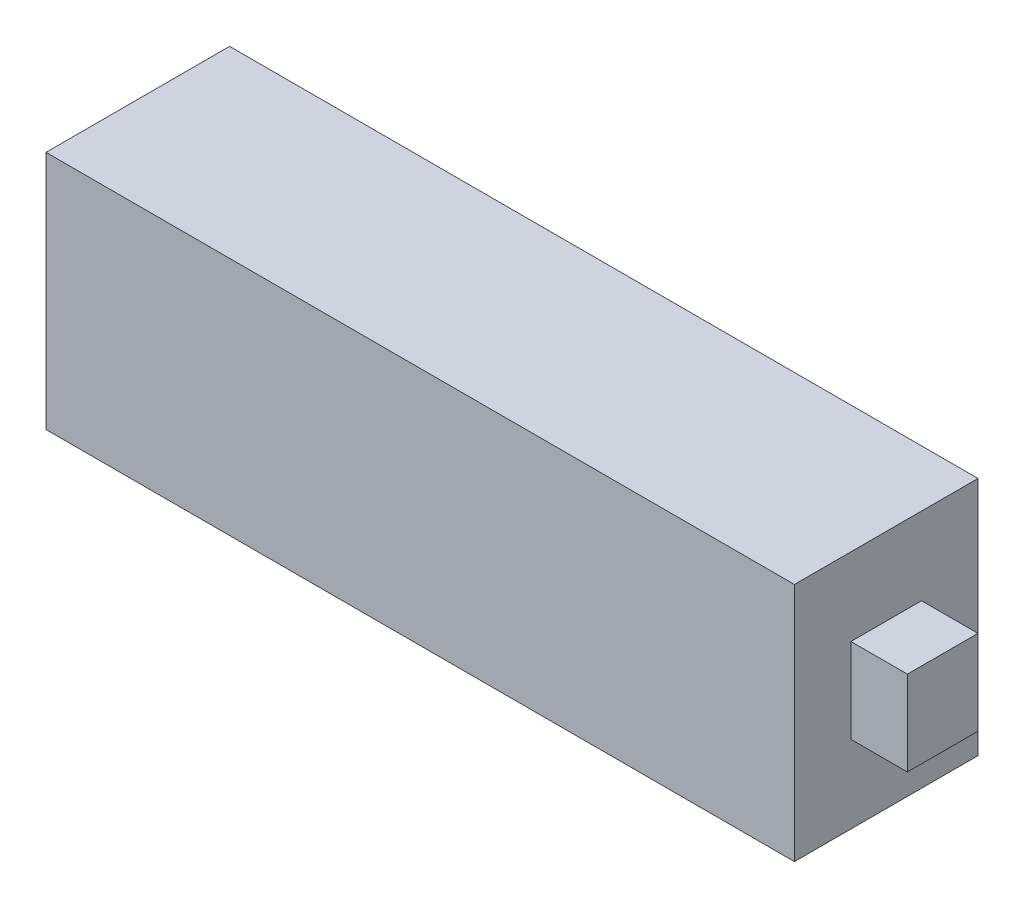
ISO-10303-21;
HEADER;
FILE_DESCRIPTION(('STEP AP214'),'2;1');
FILE_NAME('part.step','',(''),(''),'','','');
FILE_SCHEMA(('AUTOMOTIVE_DESIGN { 1 0 10303 214 1 1 1 1 }'));
ENDSEC;
DATA;
#1=APPLICATION_CONTEXT('core data for automotive mechanical design processes');
#2=APPLICATION_PROTOCOL_DEFINITION('international standard','automotive_design',2000,#1);
#3=PRODUCT_CONTEXT('',#1,'mechanical');
#4=PRODUCT('Part','Part','',(#3));
#5=PRODUCT_RELATED_PRODUCT_CATEGORY('part','',(#4));
#6=PRODUCT_DEFINITION_FORMATION('','',#4);
#7=PRODUCT_DEFINITION_CONTEXT('part definition',#1,'design');
#8=PRODUCT_DEFINITION('design','',#6,#7);
#9=PRODUCT_DEFINITION_SHAPE('','',#8);
#10=(LENGTH_UNIT() NAMED_UNIT(*) SI_UNIT(.MILLI.,.METRE.));
#11=(NAMED_UNIT(*) PLANE_ANGLE_UNIT() SI_UNIT($,.RADIAN.));
#12=(NAMED_UNIT(*) SI_UNIT($,.STERADIAN.) SOLID_ANGLE_UNIT());
#13=UNCERTAINTY_MEASURE_WITH_UNIT(LENGTH_MEASURE(1.E-05),#10,'distance_accuracy_value','');
#14=(GEOMETRIC_REPRESENTATION_CONTEXT(3) GLOBAL_UNCERTAINTY_ASSIGNED_CONTEXT((#13)) GLOBAL_UNIT_ASSIGNED_CONTEXT((#10,
#11,#12)) REPRESENTATION_CONTEXT('',''));
#15=CARTESIAN_POINT('',(0.,0.,0.));
#16=DIRECTION('',(0.,0.,1.));
#17=DIRECTION('',(1.,0.,0.));
#18=AXIS2_PLACEMENT_3D('',#15,#16,#17);
#19=CARTESIAN_POINT('',(-53.,17.,26.));
#20=DIRECTION('',(1.,0.,0.));
#21=DIRECTION('',(0.,0.,-1.));
#22=AXIS2_PLACEMENT_3D('',#19,#20,#21);
#23=PLANE('',#22);
#24=DIRECTION('',(0.,-1.,0.));
#25=VECTOR('',#24,1.);
#26=CARTESIAN_POINT('',(-53.,17.,0.));
#27=LINE('',#26,#25);
#28=CARTESIAN_POINT('',(-53.,17.,0.));
#29=VERTEX_POINT('',#28);
#30=CARTESIAN_POINT('',(-53.,-17.,0.));
#31=VERTEX_POINT('',#30);
#32=EDGE_CURVE('E136',#29,#31,#27,.T.);
#33=ORIENTED_EDGE('',*,*,#32,.T.);
#34=DIRECTION('',(0.,0.,-1.));
#35=VECTOR('',#34,1.);
#36=CARTESIAN_POINT('',(-53.,-17.,26.));
#37=LINE('',#36,#35);
#38=CARTESIAN_POINT('',(-53.,-17.,26.));
#39=VERTEX_POINT('',#38);
#40=EDGE_CURVE('E11',#39,#31,#37,.T.);
#41=ORIENTED_EDGE('',*,*,#40,.F.);
#42=DIRECTION('',(0.,-1.,0.));
#43=VECTOR('',#42,1.);
#44=CARTESIAN_POINT('',(-53.,17.,26.));
#45=LINE('',#44,#43);
#46=CARTESIAN_POINT('',(-53.,17.,26.));
#47=VERTEX_POINT('',#46);
#48=EDGE_CURVE('E144',#47,#39,#45,.T.);
#49=ORIENTED_EDGE('',*,*,#48,.F.);
#50=DIRECTION('',(0.,0.,-1.));
#51=VECTOR('',#50,1.);
#52=CARTESIAN_POINT('',(-53.,17.,26.));
#53=LINE('',#52,#51);
#54=EDGE_CURVE('E147',#47,#29,#53,.T.);
#55=ORIENTED_EDGE('',*,*,#54,.T.);
#56=EDGE_LOOP('',(#33,#41,#49,#55));
#57=FACE_BOUND('',#56,.T.);
#58=ADVANCED_FACE('F39',(#57),#23,.F.);
#59=CARTESIAN_POINT('',(-53.,-17.,26.));
#60=DIRECTION('',(0.,1.,0.));
#61=DIRECTION('',(0.,0.,1.));
#62=AXIS2_PLACEMENT_3D('',#59,#60,#61);
#63=PLANE('',#62);
#64=DIRECTION('',(1.,0.,0.));
#65=VECTOR('',#64,1.);
#66=CARTESIAN_POINT('',(-53.,-17.,0.));
#67=LINE('',#66,#65);
#68=CARTESIAN_POINT('',(53.,-17.,0.));
#69=VERTEX_POINT('',#68);
#70=EDGE_CURVE('E138',#31,#69,#67,.T.);
#71=ORIENTED_EDGE('',*,*,#70,.T.);
#72=DIRECTION('',(0.,0.,-1.));
#73=VECTOR('',#72,1.);
#74=CARTESIAN_POINT('',(53.,-17.,26.));
#75=LINE('',#74,#73);
#76=CARTESIAN_POINT('',(53.,-17.,26.));
#77=VERTEX_POINT('',#76);
#78=EDGE_CURVE('E46',#77,#69,#75,.T.);
#79=ORIENTED_EDGE('',*,*,#78,.F.);
#80=DIRECTION('',(1.,0.,0.));
#81=VECTOR('',#80,1.);
#82=CARTESIAN_POINT('',(-53.,-17.,26.));
#83=LINE('',#82,#81);
#84=EDGE_CURVE('E89',#39,#77,#83,.T.);
#85=ORIENTED_EDGE('',*,*,#84,.F.);
#86=ORIENTED_EDGE('',*,*,#40,.T.);
#87=EDGE_LOOP('',(#71,#79,#85,#86));
#88=FACE_BOUND('',#87,.T.);
#89=ADVANCED_FACE('F177',(#88),#63,.F.);
#90=CARTESIAN_POINT('',(53.,-17.,26.));
#91=DIRECTION('',(-1.,0.,0.));
#92=DIRECTION('',(0.,0.,1.));
#93=AXIS2_PLACEMENT_3D('',#90,#91,#92);
#94=PLANE('',#93);
#95=DIRECTION('',(0.,0.,-1.));
#96=VECTOR('',#95,1.);
#97=CARTESIAN_POINT('',(53.,6.,18.));
#98=LINE('',#97,#96);
#99=CARTESIAN_POINT('',(53.,6.,18.));
#100=VERTEX_POINT('',#99);
#101=CARTESIAN_POINT('',(53.,6.,8.));
#102=VERTEX_POINT('',#101);
#103=EDGE_CURVE('E265',#100,#102,#98,.T.);
#104=ORIENTED_EDGE('',*,*,#103,.T.);
#105=DIRECTION('',(0.,-1.,0.));
#106=VECTOR('',#105,1.);
#107=CARTESIAN_POINT('',(53.,6.,8.));
#108=LINE('',#107,#106);
#109=CARTESIAN_POINT('',(53.,-6.,8.));
#110=VERTEX_POINT('',#109);
#111=EDGE_CURVE('E52',#102,#110,#108,.T.);
#112=ORIENTED_EDGE('',*,*,#111,.T.);
#113=DIRECTION('',(0.,0.,-1.));
#114=VECTOR('',#113,1.);
#115=CARTESIAN_POINT('',(53.,-6.,18.));
#116=LINE('',#115,#114);
#117=CARTESIAN_POINT('',(53.,-6.,18.));
#118=VERTEX_POINT('',#117);
#119=EDGE_CURVE('E120',#118,#110,#116,.T.);
#120=ORIENTED_EDGE('',*,*,#119,.F.);
#121=DIRECTION('',(0.,-1.,0.));
#122=VECTOR('',#121,1.);
#123=CARTESIAN_POINT('',(53.,6.,18.));
#124=LINE('',#123,#122);
#125=EDGE_CURVE('E122',#100,#118,#124,.T.);
#126=ORIENTED_EDGE('',*,*,#125,.F.);
#127=EDGE_LOOP('',(#104,#112,#120,#126));
#128=FACE_BOUND('',#127,.T.);
#129=DIRECTION('',(0.,1.,0.));
#130=VECTOR('',#129,1.);
#131=CARTESIAN_POINT('',(53.,-17.,0.));
#132=LINE('',#131,#130);
#133=CARTESIAN_POINT('',(53.,17.,0.));
#134=VERTEX_POINT('',#133);
#135=EDGE_CURVE('E153',#69,#134,#132,.T.);
#136=ORIENTED_EDGE('',*,*,#135,.T.);
#137=DIRECTION('',(0.,0.,-1.));
#138=VECTOR('',#137,1.);
#139=CARTESIAN_POINT('',(53.,17.,26.));
#140=LINE('',#139,#138);
#141=CARTESIAN_POINT('',(53.,17.,26.));
#142=VERTEX_POINT('',#141);
#143=EDGE_CURVE('E160',#142,#134,#140,.T.);
#144=ORIENTED_EDGE('',*,*,#143,.F.);
#145=DIRECTION('',(0.,1.,0.));
#146=VECTOR('',#145,1.);
#147=CARTESIAN_POINT('',(53.,-17.,26.));
#148=LINE('',#147,#146);
#149=EDGE_CURVE('E146',#77,#142,#148,.T.);
#150=ORIENTED_EDGE('',*,*,#149,.F.);
#151=ORIENTED_EDGE('',*,*,#78,.T.);
#152=EDGE_LOOP('',(#136,#144,#150,#151));
#153=FACE_BOUND('',#152,.T.);
#154=ADVANCED_FACE('F131',(#128,#153),#94,.F.);
#155=CARTESIAN_POINT('',(53.,17.,26.));
#156=DIRECTION('',(0.,-1.,0.));
#157=DIRECTION('',(0.,0.,-1.));
#158=AXIS2_PLACEMENT_3D('',#155,#156,#157);
#159=PLANE('',#158);
#160=DIRECTION('',(-1.,0.,0.));
#161=VECTOR('',#160,1.);
#162=CARTESIAN_POINT('',(53.,17.,0.));
#163=LINE('',#162,#161);
#164=EDGE_CURVE('E82',#134,#29,#163,.T.);
#165=ORIENTED_EDGE('',*,*,#164,.T.);
#166=ORIENTED_EDGE('',*,*,#54,.F.);
#167=DIRECTION('',(-1.,0.,0.));
#168=VECTOR('',#167,1.);
#169=CARTESIAN_POINT('',(53.,17.,26.));
#170=LINE('',#169,#168);
#171=EDGE_CURVE('E65',#142,#47,#170,.T.);
#172=ORIENTED_EDGE('',*,*,#171,.F.);
#173=ORIENTED_EDGE('',*,*,#143,.T.);
#174=EDGE_LOOP('',(#165,#166,#172,#173));
#175=FACE_BOUND('',#174,.T.);
#176=ADVANCED_FACE('F169',(#175),#159,.F.);
#177=CARTESIAN_POINT('',(0.,0.,26.));
#178=DIRECTION('',(0.,0.,1.));
#179=DIRECTION('',(1.,0.,0.));
#180=AXIS2_PLACEMENT_3D('',#177,#178,#179);
#181=PLANE('',#180);
#182=ORIENTED_EDGE('',*,*,#48,.T.);
#183=ORIENTED_EDGE('',*,*,#84,.T.);
#184=ORIENTED_EDGE('',*,*,#149,.T.);
#185=ORIENTED_EDGE('',*,*,#171,.T.);
#186=EDGE_LOOP('',(#182,#183,#184,#185));
#187=FACE_BOUND('',#186,.T.);
#188=ADVANCED_FACE('F168',(#187),#181,.T.);
#189=CARTESIAN_POINT('',(0.,0.,0.));
#190=DIRECTION('',(0.,0.,1.));
#191=DIRECTION('',(1.,0.,0.));
#192=AXIS2_PLACEMENT_3D('',#189,#190,#191);
#193=PLANE('',#192);
#194=ORIENTED_EDGE('',*,*,#32,.F.);
#195=ORIENTED_EDGE('',*,*,#164,.F.);
#196=ORIENTED_EDGE('',*,*,#135,.F.);
#197=ORIENTED_EDGE('',*,*,#70,.F.);
#198=EDGE_LOOP('',(#194,#195,#196,#197));
#199=FACE_BOUND('',#198,.T.);
#200=ADVANCED_FACE('F163',(#199),#193,.F.);
#201=CARTESIAN_POINT('',(53.,-6.,18.));
#202=DIRECTION('',(0.,1.,0.));
#203=DIRECTION('',(0.,0.,1.));
#204=AXIS2_PLACEMENT_3D('',#201,#202,#203);
#205=PLANE('',#204);
#206=DIRECTION('',(1.,0.,0.));
#207=VECTOR('',#206,1.);
#208=CARTESIAN_POINT('',(53.,-6.,8.));
#209=LINE('',#208,#207);
#210=CARTESIAN_POINT('',(61.,-6.,8.));
#211=VERTEX_POINT('',#210);
#212=EDGE_CURVE('E271',#110,#211,#209,.T.);
#213=ORIENTED_EDGE('',*,*,#212,.T.);
#214=DIRECTION('',(0.,0.,-1.));
#215=VECTOR('',#214,1.);
#216=CARTESIAN_POINT('',(61.,-6.,18.));
#217=LINE('',#216,#215);
#218=CARTESIAN_POINT('',(61.,-6.,18.));
#219=VERTEX_POINT('',#218);
#220=EDGE_CURVE('E116',#219,#211,#217,.T.);
#221=ORIENTED_EDGE('',*,*,#220,.F.);
#222=DIRECTION('',(1.,0.,0.));
#223=VECTOR('',#222,1.);
#224=CARTESIAN_POINT('',(53.,-6.,18.));
#225=LINE('',#224,#223);
#226=EDGE_CURVE('E114',#118,#219,#225,.T.);
#227=ORIENTED_EDGE('',*,*,#226,.F.);
#228=ORIENTED_EDGE('',*,*,#119,.T.);
#229=EDGE_LOOP('',(#213,#221,#227,#228));
#230=FACE_BOUND('',#229,.T.);
#231=ADVANCED_FACE('F113',(#230),#205,.F.);
#232=CARTESIAN_POINT('',(61.,-6.,18.));
#233=DIRECTION('',(-1.,0.,0.));
#234=DIRECTION('',(0.,0.,1.));
#235=AXIS2_PLACEMENT_3D('',#232,#233,#234);
#236=PLANE('',#235);
#237=DIRECTION('',(0.,1.,0.));
#238=VECTOR('',#237,1.);
#239=CARTESIAN_POINT('',(61.,-6.,8.));
#240=LINE('',#239,#238);
#241=CARTESIAN_POINT('',(61.,6.,8.));
#242=VERTEX_POINT('',#241);
#243=EDGE_CURVE('E264',#211,#242,#240,.T.);
#244=ORIENTED_EDGE('',*,*,#243,.T.);
#245=DIRECTION('',(0.,0.,-1.));
#246=VECTOR('',#245,1.);
#247=CARTESIAN_POINT('',(61.,6.,18.));
#248=LINE('',#247,#246);
#249=CARTESIAN_POINT('',(61.,6.,18.));
#250=VERTEX_POINT('',#249);
#251=EDGE_CURVE('E143',#250,#242,#248,.T.);
#252=ORIENTED_EDGE('',*,*,#251,.F.);
#253=DIRECTION('',(0.,1.,0.));
#254=VECTOR('',#253,1.);
#255=CARTESIAN_POINT('',(61.,-6.,18.));
#256=LINE('',#255,#254);
#257=EDGE_CURVE('E125',#219,#250,#256,.T.);
#258=ORIENTED_EDGE('',*,*,#257,.F.);
#259=ORIENTED_EDGE('',*,*,#220,.T.);
#260=EDGE_LOOP('',(#244,#252,#258,#259));
#261=FACE_BOUND('',#260,.T.);
#262=ADVANCED_FACE('F225',(#261),#236,.F.);
#263=CARTESIAN_POINT('',(61.,6.,18.));
#264=DIRECTION('',(0.,-1.,0.));
#265=DIRECTION('',(0.,0.,-1.));
#266=AXIS2_PLACEMENT_3D('',#263,#264,#265);
#267=PLANE('',#266);
#268=DIRECTION('',(-1.,0.,0.));
#269=VECTOR('',#268,1.);
#270=CARTESIAN_POINT('',(61.,6.,8.));
#271=LINE('',#270,#269);
#272=EDGE_CURVE('E135',#242,#102,#271,.T.);
#273=ORIENTED_EDGE('',*,*,#272,.T.);
#274=ORIENTED_EDGE('',*,*,#103,.F.);
#275=DIRECTION('',(-1.,0.,0.));
#276=VECTOR('',#275,1.);
#277=CARTESIAN_POINT('',(61.,6.,18.));
#278=LINE('',#277,#276);
#279=EDGE_CURVE('E126',#250,#100,#278,.T.);
#280=ORIENTED_EDGE('',*,*,#279,.F.);
#281=ORIENTED_EDGE('',*,*,#251,.T.);
#282=EDGE_LOOP('',(#273,#274,#280,#281));
#283=FACE_BOUND('',#282,.T.);
#284=ADVANCED_FACE('F231',(#283),#267,.F.);
#285=CARTESIAN_POINT('',(0.,0.,18.));
#286=DIRECTION('',(0.,0.,1.));
#287=DIRECTION('',(1.,0.,0.));
#288=AXIS2_PLACEMENT_3D('',#285,#286,#287);
#289=PLANE('',#288);
#290=ORIENTED_EDGE('',*,*,#125,.T.);
#291=ORIENTED_EDGE('',*,*,#226,.T.);
#292=ORIENTED_EDGE('',*,*,#257,.T.);
#293=ORIENTED_EDGE('',*,*,#279,.T.);
#294=EDGE_LOOP('',(#290,#291,#292,#293));
#295=FACE_BOUND('',#294,.T.);
#296=ADVANCED_FACE('F127',(#295),#289,.T.);
#297=CARTESIAN_POINT('',(0.,0.,8.));
#298=DIRECTION('',(0.,0.,1.));
#299=DIRECTION('',(1.,0.,0.));
#300=AXIS2_PLACEMENT_3D('',#297,#298,#299);
#301=PLANE('',#300);
#302=ORIENTED_EDGE('',*,*,#111,.F.);
#303=ORIENTED_EDGE('',*,*,#272,.F.);
#304=ORIENTED_EDGE('',*,*,#243,.F.);
#305=ORIENTED_EDGE('',*,*,#212,.F.);
#306=EDGE_LOOP('',(#302,#303,#304,#305));
#307=FACE_BOUND('',#306,.T.);
#308=ADVANCED_FACE('F249',(#307),#301,.F.);
#309=CLOSED_SHELL('',(#58,#89,#154,#176,#188,#200,#231,#262,#284,#296,#308));
#310=MANIFOLD_SOLID_BREP('B2',#309);
#311=ADVANCED_BREP_SHAPE_REPRESENTATION('',(#18,#310),#14);
#312=SHAPE_DEFINITION_REPRESENTATION(#9,#311);
ENDSEC;
END-ISO-10303-21;
